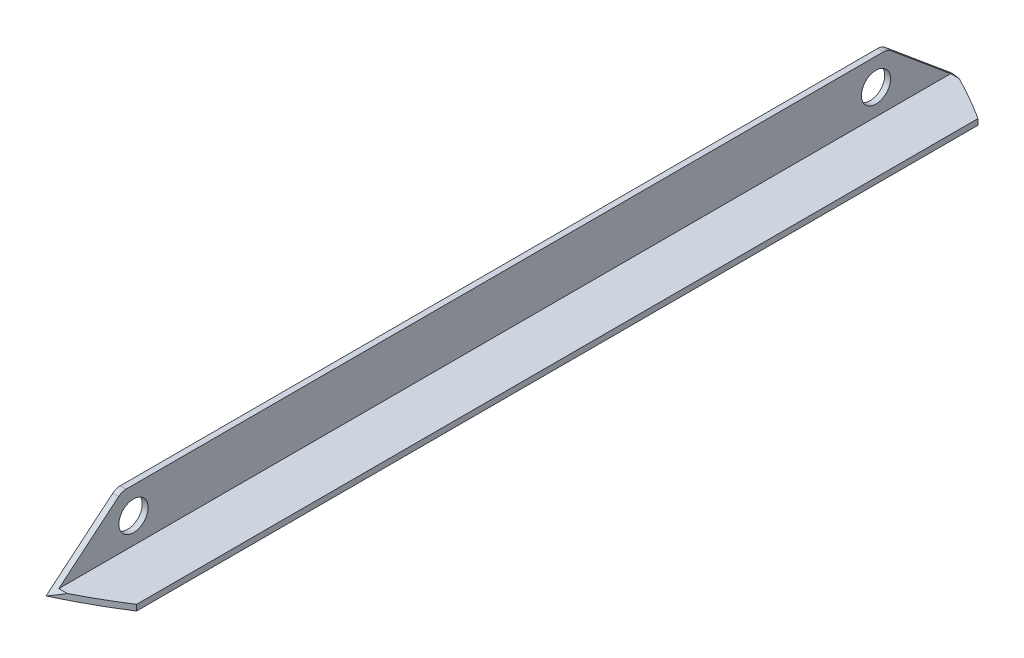
ISO-10303-21;
HEADER;
FILE_DESCRIPTION(('STEP AP214'),'2;1');
FILE_NAME('part.step','',(''),(''),'','','');
FILE_SCHEMA(('AUTOMOTIVE_DESIGN { 1 0 10303 214 1 1 1 1 }'));
ENDSEC;
DATA;
#1=APPLICATION_CONTEXT('core data for automotive mechanical design processes');
#2=APPLICATION_PROTOCOL_DEFINITION('international standard','automotive_design',2000,#1);
#3=PRODUCT_CONTEXT('',#1,'mechanical');
#4=PRODUCT('Part','Part','',(#3));
#5=PRODUCT_RELATED_PRODUCT_CATEGORY('part','',(#4));
#6=PRODUCT_DEFINITION_FORMATION('','',#4);
#7=PRODUCT_DEFINITION_CONTEXT('part definition',#1,'design');
#8=PRODUCT_DEFINITION('design','',#6,#7);
#9=PRODUCT_DEFINITION_SHAPE('','',#8);
#10=(LENGTH_UNIT() NAMED_UNIT(*) SI_UNIT(.MILLI.,.METRE.));
#11=(NAMED_UNIT(*) PLANE_ANGLE_UNIT() SI_UNIT($,.RADIAN.));
#12=(NAMED_UNIT(*) SI_UNIT($,.STERADIAN.) SOLID_ANGLE_UNIT());
#13=UNCERTAINTY_MEASURE_WITH_UNIT(LENGTH_MEASURE(1.E-05),#10,'distance_accuracy_value','');
#14=(GEOMETRIC_REPRESENTATION_CONTEXT(3) GLOBAL_UNCERTAINTY_ASSIGNED_CONTEXT((#13)) GLOBAL_UNIT_ASSIGNED_CONTEXT((#10,
#11,#12)) REPRESENTATION_CONTEXT('',''));
#15=CARTESIAN_POINT('',(0.,0.,0.));
#16=DIRECTION('',(0.,0.,1.));
#17=DIRECTION('',(1.,0.,0.));
#18=AXIS2_PLACEMENT_3D('',#15,#16,#17);
#19=CARTESIAN_POINT('',(-9.02439024390239,-5.73170731707306,500.));
#20=DIRECTION('',(0.,1.,0.));
#21=DIRECTION('',(-0.999999999999999,0.,0.));
#22=AXIS2_PLACEMENT_3D('',#19,#20,#21);
#23=PLANE('',#22);
#24=DIRECTION('',(0.,0.,-0.999999999999999));
#25=VECTOR('',#24,1.);
#26=CARTESIAN_POINT('',(-9.02439024390239,-5.73170731707306,500.));
#27=LINE('',#26,#25);
#28=CARTESIAN_POINT('',(-9.02439024390239,-5.73170731707306,382.162337173508));
#29=VERTEX_POINT('',#28);
#30=CARTESIAN_POINT('',(-9.02439024390239,-5.73170731707306,-382.162337173507));
#31=VERTEX_POINT('',#30);
#32=EDGE_CURVE('E130',#29,#31,#27,.T.);
#33=ORIENTED_EDGE('',*,*,#32,.F.);
#34=DIRECTION('',(0.999999999999999,0.,0.));
#35=VECTOR('',#34,1.);
#36=CARTESIAN_POINT('',(-9.02439024390239,-5.73170731707306,382.162337173508));
#37=LINE('',#36,#35);
#38=CARTESIAN_POINT('',(-1.70953517318789,-5.73170731707306,382.162337173508));
#39=VERTEX_POINT('',#38);
#40=EDGE_CURVE('E114',#29,#39,#37,.T.);
#41=ORIENTED_EDGE('',*,*,#40,.T.);
#42=CARTESIAN_POINT('',(-195.524390243902,-5.73170731707306,0.));
#43=DIRECTION('',(0.,1.,0.));
#44=DIRECTION('',(-0.999999999999999,0.,0.));
#45=AXIS2_PLACEMENT_3D('',#42,#43,#44);
#46=CIRCLE('',#45,428.5);
#47=CARTESIAN_POINT('',(35.9756097560976,-5.73170731707306,360.582861489561));
#48=VERTEX_POINT('',#47);
#49=EDGE_CURVE('E126',#48,#39,#46,.F.);
#50=ORIENTED_EDGE('',*,*,#49,.F.);
#51=DIRECTION('',(0.,0.,-0.999999999999999));
#52=VECTOR('',#51,1.);
#53=CARTESIAN_POINT('',(35.9756097560976,-5.73170731707306,500.));
#54=LINE('',#53,#52);
#55=CARTESIAN_POINT('',(35.9756097560976,-5.73170731707306,-360.582861489561));
#56=VERTEX_POINT('',#55);
#57=EDGE_CURVE('E146',#48,#56,#54,.T.);
#58=ORIENTED_EDGE('',*,*,#57,.T.);
#59=CARTESIAN_POINT('',(-195.524390243902,-5.73170731707306,0.));
#60=DIRECTION('',(0.,1.,0.));
#61=DIRECTION('',(-0.999999999999999,0.,0.));
#62=AXIS2_PLACEMENT_3D('',#59,#60,#61);
#63=CIRCLE('',#62,428.5);
#64=CARTESIAN_POINT('',(-1.70953517318789,-5.73170731707306,-382.162337173507));
#65=VERTEX_POINT('',#64);
#66=EDGE_CURVE('E138',#65,#56,#63,.F.);
#67=ORIENTED_EDGE('',*,*,#66,.F.);
#68=DIRECTION('',(0.999999999999999,0.,0.));
#69=VECTOR('',#68,1.);
#70=CARTESIAN_POINT('',(-9.02439024390256,-5.73170731707306,-382.162337173507));
#71=LINE('',#70,#69);
#72=EDGE_CURVE('E194',#31,#65,#71,.T.);
#73=ORIENTED_EDGE('',*,*,#72,.F.);
#74=EDGE_LOOP('',(#33,#41,#50,#58,#67,#73));
#75=FACE_BOUND('',#74,.T.);
#76=ADVANCED_FACE('F36',(#75),#23,.T.);
#77=CARTESIAN_POINT('',(-14.0243902439024,39.2682926829269,500.));
#78=DIRECTION('',(0.,1.,0.));
#79=DIRECTION('',(0.,0.,0.999999999999999));
#80=AXIS2_PLACEMENT_3D('',#77,#78,#79);
#81=PLANE('',#80);
#82=DIRECTION('',(0.,0.,-0.999999999999999));
#83=VECTOR('',#82,1.);
#84=CARTESIAN_POINT('',(-14.0243902439024,39.2682926829269,500.));
#85=LINE('',#84,#83);
#86=CARTESIAN_POINT('',(-14.0243902439024,39.2682926829269,324.541837821695));
#87=VERTEX_POINT('',#86);
#88=CARTESIAN_POINT('',(-14.0243902439024,39.2682926829269,-324.541837821694));
#89=VERTEX_POINT('',#88);
#90=EDGE_CURVE('E153',#87,#89,#85,.T.);
#91=ORIENTED_EDGE('',*,*,#90,.F.);
#92=DIRECTION('',(0.999999999999999,0.,0.));
#93=VECTOR('',#92,1.);
#94=CARTESIAN_POINT('',(-14.0243902439024,39.2682926829269,324.541837821695));
#95=LINE('',#94,#93);
#96=CARTESIAN_POINT('',(-9.02439024390245,39.2682926829269,324.541837821695));
#97=VERTEX_POINT('',#96);
#98=EDGE_CURVE('E167',#87,#97,#95,.T.);
#99=ORIENTED_EDGE('',*,*,#98,.T.);
#100=DIRECTION('',(0.,0.,-0.999999999999999));
#101=VECTOR('',#100,1.);
#102=CARTESIAN_POINT('',(-9.02439024390245,39.2682926829269,500.));
#103=LINE('',#102,#101);
#104=CARTESIAN_POINT('',(-9.02439024390243,39.2682926829269,-324.541837821694));
#105=VERTEX_POINT('',#104);
#106=EDGE_CURVE('E150',#97,#105,#103,.T.);
#107=ORIENTED_EDGE('',*,*,#106,.T.);
#108=DIRECTION('',(0.999999999999999,0.,0.));
#109=VECTOR('',#108,1.);
#110=CARTESIAN_POINT('',(-14.0243902439024,39.2682926829269,-324.541837821694));
#111=LINE('',#110,#109);
#112=EDGE_CURVE('E120',#105,#89,#111,.F.);
#113=ORIENTED_EDGE('',*,*,#112,.T.);
#114=EDGE_LOOP('',(#91,#99,#107,#113));
#115=FACE_BOUND('',#114,.T.);
#116=ADVANCED_FACE('F219',(#115),#81,.T.);
#117=CARTESIAN_POINT('',(-9.02439024390245,39.2682926829269,500.));
#118=DIRECTION('',(0.999999999999999,0.,0.));
#119=DIRECTION('',(0.,1.,0.));
#120=AXIS2_PLACEMENT_3D('',#117,#118,#119);
#121=PLANE('',#120);
#122=CARTESIAN_POINT('',(-9.02439024390243,16.2682926829267,-318.162337173507));
#123=DIRECTION('',(0.999999999999999,0.,0.));
#124=DIRECTION('',(0.,1.,0.));
#125=AXIS2_PLACEMENT_3D('',#122,#123,#124);
#126=CIRCLE('',#125,12.5);
#127=CARTESIAN_POINT('',(-9.02439024390243,28.7682926829267,-318.162337173507));
#128=VERTEX_POINT('',#127);
#129=EDGE_CURVE('E178',#128,#128,#126,.T.);
#130=ORIENTED_EDGE('',*,*,#129,.F.);
#131=EDGE_LOOP('',(#130));
#132=FACE_BOUND('',#131,.T.);
#133=CARTESIAN_POINT('',(-9.02439024390245,16.2682926829267,318.162337173508));
#134=DIRECTION('',(0.999999999999999,0.,0.));
#135=DIRECTION('',(0.,-1.,0.));
#136=AXIS2_PLACEMENT_3D('',#133,#134,#135);
#137=CIRCLE('',#136,12.5);
#138=CARTESIAN_POINT('',(-9.02439024390245,28.7682926829267,318.162337173508));
#139=VERTEX_POINT('',#138);
#140=EDGE_CURVE('E183',#139,#139,#137,.T.);
#141=ORIENTED_EDGE('',*,*,#140,.F.);
#142=EDGE_LOOP('',(#141));
#143=FACE_BOUND('',#142,.T.);
#144=ORIENTED_EDGE('',*,*,#106,.F.);
#145=CARTESIAN_POINT('',(-9.02439024390245,29.2682926829269,324.541837821695));
#146=DIRECTION('',(0.999999999999999,0.,0.));
#147=DIRECTION('',(0.,1.,0.));
#148=AXIS2_PLACEMENT_3D('',#145,#146,#147);
#149=CIRCLE('',#148,10.);
#150=CARTESIAN_POINT('',(-9.02439024390245,36.9505054789006,330.943681818339));
#151=VERTEX_POINT('',#150);
#152=EDGE_CURVE('E172',#97,#151,#149,.T.);
#153=ORIENTED_EDGE('',*,*,#152,.T.);
#154=DIRECTION('',(0.,-0.64018439966448,0.768221279597375));
#155=VECTOR('',#154,1.);
#156=CARTESIAN_POINT('',(-9.02439024390238,-45.2420332973151,429.574728349798));
#157=LINE('',#156,#155);
#158=EDGE_CURVE('E131',#151,#29,#157,.T.);
#159=ORIENTED_EDGE('',*,*,#158,.T.);
#160=ORIENTED_EDGE('',*,*,#32,.T.);
#161=DIRECTION('',(0.,-0.64018439966448,-0.768221279597375));
#162=VECTOR('',#161,1.);
#163=CARTESIAN_POINT('',(-9.02439024390245,446.56124539121,160.589206076431));
#164=LINE('',#163,#162);
#165=CARTESIAN_POINT('',(-9.02439024390243,36.9505054789006,-330.943681818339));
#166=VERTEX_POINT('',#165);
#167=EDGE_CURVE('E140',#166,#31,#164,.T.);
#168=ORIENTED_EDGE('',*,*,#167,.F.);
#169=CARTESIAN_POINT('',(-9.02439024390243,29.2682926829269,-324.541837821694));
#170=DIRECTION('',(0.999999999999999,0.,0.));
#171=DIRECTION('',(0.,1.,0.));
#172=AXIS2_PLACEMENT_3D('',#169,#170,#171);
#173=CIRCLE('',#172,10.);
#174=EDGE_CURVE('E170',#166,#105,#173,.T.);
#175=ORIENTED_EDGE('',*,*,#174,.T.);
#176=EDGE_LOOP('',(#144,#153,#159,#160,#168,#175));
#177=FACE_BOUND('',#176,.T.);
#178=ADVANCED_FACE('F201',(#132,#143,#177),#121,.T.);
#179=CARTESIAN_POINT('',(-14.0243902439024,-10.7317073170732,500.));
#180=DIRECTION('',(-0.999999999999999,0.,0.));
#181=DIRECTION('',(0.,0.,0.999999999999999));
#182=AXIS2_PLACEMENT_3D('',#179,#180,#181);
#183=PLANE('',#182);
#184=CARTESIAN_POINT('',(-14.0243902439024,16.2682926829267,-318.162337173507));
#185=DIRECTION('',(-0.999999999999999,0.,0.));
#186=DIRECTION('',(0.,0.,0.999999999999999));
#187=AXIS2_PLACEMENT_3D('',#184,#185,#186);
#188=CIRCLE('',#187,12.5);
#189=CARTESIAN_POINT('',(-14.0243902439024,28.7682926829267,-318.162337173507));
#190=VERTEX_POINT('',#189);
#191=EDGE_CURVE('E40',#190,#190,#188,.T.);
#192=ORIENTED_EDGE('',*,*,#191,.F.);
#193=EDGE_LOOP('',(#192));
#194=FACE_BOUND('',#193,.T.);
#195=CARTESIAN_POINT('',(-14.0243902439024,16.2682926829267,318.162337173508));
#196=DIRECTION('',(-0.999999999999999,0.,0.));
#197=DIRECTION('',(0.,0.,0.999999999999999));
#198=AXIS2_PLACEMENT_3D('',#195,#196,#197);
#199=CIRCLE('',#198,12.5);
#200=CARTESIAN_POINT('',(-14.0243902439025,28.7682926829267,318.162337173508));
#201=VERTEX_POINT('',#200);
#202=EDGE_CURVE('E176',#201,#201,#199,.T.);
#203=ORIENTED_EDGE('',*,*,#202,.F.);
#204=EDGE_LOOP('',(#203));
#205=FACE_BOUND('',#204,.T.);
#206=DIRECTION('',(0.,0.64018439966448,-0.768221279597375));
#207=VECTOR('',#206,1.);
#208=CARTESIAN_POINT('',(-14.0243902439024,-65.7338365760036,454.164892284224));
#209=LINE('',#208,#207);
#210=CARTESIAN_POINT('',(-14.0243902439024,-10.7317073170732,388.162337173508));
#211=VERTEX_POINT('',#210);
#212=CARTESIAN_POINT('',(-14.0243902439024,36.9505054789006,330.943681818339));
#213=VERTEX_POINT('',#212);
#214=EDGE_CURVE('E116',#211,#213,#209,.T.);
#215=ORIENTED_EDGE('',*,*,#214,.T.);
#216=CARTESIAN_POINT('',(-14.0243902439024,29.2682926829269,324.541837821695));
#217=DIRECTION('',(-0.999999999999999,0.,0.));
#218=DIRECTION('',(0.,0.,0.999999999999999));
#219=AXIS2_PLACEMENT_3D('',#216,#217,#218);
#220=CIRCLE('',#219,10.);
#221=EDGE_CURVE('E45',#213,#87,#220,.T.);
#222=ORIENTED_EDGE('',*,*,#221,.T.);
#223=ORIENTED_EDGE('',*,*,#90,.T.);
#224=CARTESIAN_POINT('',(-14.0243902439024,29.2682926829269,-324.541837821694));
#225=DIRECTION('',(-0.999999999999999,0.,0.));
#226=DIRECTION('',(0.,0.,0.999999999999999));
#227=AXIS2_PLACEMENT_3D('',#224,#225,#226);
#228=CIRCLE('',#227,10.);
#229=CARTESIAN_POINT('',(-14.0243902439024,36.9505054789006,-330.943681818339));
#230=VERTEX_POINT('',#229);
#231=EDGE_CURVE('E53',#89,#230,#228,.T.);
#232=ORIENTED_EDGE('',*,*,#231,.T.);
#233=DIRECTION('',(0.,0.64018439966448,0.768221279597375));
#234=VECTOR('',#233,1.);
#235=CARTESIAN_POINT('',(-14.0243902439024,426.069442112521,135.999042142005));
#236=LINE('',#235,#234);
#237=CARTESIAN_POINT('',(-14.0243902439023,-10.7317073170732,-388.162337173507));
#238=VERTEX_POINT('',#237);
#239=EDGE_CURVE('E192',#238,#230,#236,.T.);
#240=ORIENTED_EDGE('',*,*,#239,.F.);
#241=DIRECTION('',(0.,0.,-0.999999999999999));
#242=VECTOR('',#241,1.);
#243=CARTESIAN_POINT('',(-14.0243902439024,-10.7317073170732,500.));
#244=LINE('',#243,#242);
#245=EDGE_CURVE('E155',#211,#238,#244,.T.);
#246=ORIENTED_EDGE('',*,*,#245,.F.);
#247=EDGE_LOOP('',(#215,#222,#223,#232,#240,#246));
#248=FACE_BOUND('',#247,.T.);
#249=ADVANCED_FACE('F213',(#194,#205,#248),#183,.T.);
#250=CARTESIAN_POINT('',(-195.524390243902,-30.7317073170734,0.));
#251=DIRECTION('',(0.,1.,0.));
#252=DIRECTION('',(-0.999999999999999,0.,0.));
#253=AXIS2_PLACEMENT_3D('',#250,#251,#252);
#254=CYLINDRICAL_SURFACE('',#253,428.5);
#255=CARTESIAN_POINT('',(-195.524390243902,312.736906994183,0.));
#256=DIRECTION('',(0.,0.768221279597376,0.640184399664479));
#257=DIRECTION('',(0.,0.64018439966448,-0.768221279597375));
#258=AXIS2_PLACEMENT_3D('',#255,#256,#257);
#259=ELLIPSE('',#258,557.781997687667,428.5);
#260=EDGE_CURVE('E111',#211,#39,#259,.T.);
#261=ORIENTED_EDGE('',*,*,#260,.F.);
#262=CARTESIAN_POINT('',(-195.524390243902,-10.7317073170732,0.));
#263=DIRECTION('',(0.,-1.,0.));
#264=DIRECTION('',(0.999999999999999,0.,0.));
#265=AXIS2_PLACEMENT_3D('',#262,#263,#264);
#266=CIRCLE('',#265,428.5);
#267=CARTESIAN_POINT('',(35.9756097560976,-10.7317073170732,360.582861489561));
#268=VERTEX_POINT('',#267);
#269=EDGE_CURVE('E148',#211,#268,#266,.F.);
#270=ORIENTED_EDGE('',*,*,#269,.T.);
#271=DIRECTION('',(0.,1.,0.));
#272=VECTOR('',#271,1.);
#273=CARTESIAN_POINT('',(35.9756097560976,-30.7317073170734,360.582861489561));
#274=LINE('',#273,#272);
#275=EDGE_CURVE('E135',#268,#48,#274,.T.);
#276=ORIENTED_EDGE('',*,*,#275,.T.);
#277=ORIENTED_EDGE('',*,*,#49,.T.);
#278=EDGE_LOOP('',(#261,#270,#276,#277));
#279=FACE_BOUND('',#278,.T.);
#280=ADVANCED_FACE('F133',(#279),#254,.T.);
#281=CARTESIAN_POINT('',(35.9756097560976,-10.7317073170732,500.));
#282=DIRECTION('',(0.,-1.,0.));
#283=DIRECTION('',(0.999999999999999,0.,0.));
#284=AXIS2_PLACEMENT_3D('',#281,#282,#283);
#285=PLANE('',#284);
#286=CARTESIAN_POINT('',(-195.524390243902,-10.7317073170732,0.));
#287=DIRECTION('',(0.,-1.,0.));
#288=DIRECTION('',(0.999999999999999,0.,0.));
#289=AXIS2_PLACEMENT_3D('',#286,#287,#288);
#290=CIRCLE('',#289,428.5);
#291=CARTESIAN_POINT('',(35.9756097560976,-10.7317073170732,-360.582861489561));
#292=VERTEX_POINT('',#291);
#293=EDGE_CURVE('E161',#292,#238,#290,.F.);
#294=ORIENTED_EDGE('',*,*,#293,.F.);
#295=DIRECTION('',(0.,0.,-0.999999999999999));
#296=VECTOR('',#295,1.);
#297=CARTESIAN_POINT('',(35.9756097560976,-10.7317073170732,500.));
#298=LINE('',#297,#296);
#299=EDGE_CURVE('E145',#268,#292,#298,.T.);
#300=ORIENTED_EDGE('',*,*,#299,.F.);
#301=ORIENTED_EDGE('',*,*,#269,.F.);
#302=ORIENTED_EDGE('',*,*,#245,.T.);
#303=EDGE_LOOP('',(#294,#300,#301,#302));
#304=FACE_BOUND('',#303,.T.);
#305=ADVANCED_FACE('F211',(#304),#285,.T.);
#306=CARTESIAN_POINT('',(35.9756097560976,-5.73170731707306,500.));
#307=DIRECTION('',(0.999999999999999,0.,0.));
#308=DIRECTION('',(0.,0.,-0.999999999999999));
#309=AXIS2_PLACEMENT_3D('',#306,#307,#308);
#310=PLANE('',#309);
#311=DIRECTION('',(0.,1.,0.));
#312=VECTOR('',#311,1.);
#313=CARTESIAN_POINT('',(35.9756097560976,-30.7317073170734,-360.582861489561));
#314=LINE('',#313,#312);
#315=EDGE_CURVE('E136',#56,#292,#314,.F.);
#316=ORIENTED_EDGE('',*,*,#315,.F.);
#317=ORIENTED_EDGE('',*,*,#57,.F.);
#318=ORIENTED_EDGE('',*,*,#275,.F.);
#319=ORIENTED_EDGE('',*,*,#299,.T.);
#320=EDGE_LOOP('',(#316,#317,#318,#319));
#321=FACE_BOUND('',#320,.T.);
#322=ADVANCED_FACE('F208',(#321),#310,.T.);
#323=CARTESIAN_POINT('',(-195.524390243902,-30.7317073170734,0.));
#324=DIRECTION('',(0.,1.,0.));
#325=DIRECTION('',(-0.999999999999999,0.,0.));
#326=AXIS2_PLACEMENT_3D('',#323,#324,#325);
#327=CYLINDRICAL_SURFACE('',#326,428.5);
#328=ORIENTED_EDGE('',*,*,#293,.T.);
#329=CARTESIAN_POINT('',(-195.524390243902,312.736906994183,0.));
#330=DIRECTION('',(0.,-0.768221279597376,0.640184399664479));
#331=DIRECTION('',(0.,0.64018439966448,0.768221279597375));
#332=AXIS2_PLACEMENT_3D('',#329,#330,#331);
#333=ELLIPSE('',#332,557.781997687667,428.5);
#334=EDGE_CURVE('E121',#238,#65,#333,.T.);
#335=ORIENTED_EDGE('',*,*,#334,.T.);
#336=ORIENTED_EDGE('',*,*,#66,.T.);
#337=ORIENTED_EDGE('',*,*,#315,.T.);
#338=EDGE_LOOP('',(#328,#335,#336,#337));
#339=FACE_BOUND('',#338,.T.);
#340=ADVANCED_FACE('F205',(#339),#327,.T.);
#341=CARTESIAN_POINT('',(-44.0243902439024,-10.7317073170732,-388.162337173507));
#342=DIRECTION('',(0.,-0.768221279597376,0.640184399664479));
#343=DIRECTION('',(0.,-0.64018439966448,-0.768221279597375));
#344=AXIS2_PLACEMENT_3D('',#341,#342,#343);
#345=PLANE('',#344);
#346=ORIENTED_EDGE('',*,*,#239,.T.);
#347=DIRECTION('',(0.999999999999999,0.,0.));
#348=VECTOR('',#347,1.);
#349=CARTESIAN_POINT('',(-9.02439024390243,36.9505054789006,-330.943681818339));
#350=LINE('',#349,#348);
#351=EDGE_CURVE('E11',#230,#166,#350,.T.);
#352=ORIENTED_EDGE('',*,*,#351,.T.);
#353=ORIENTED_EDGE('',*,*,#167,.T.);
#354=ORIENTED_EDGE('',*,*,#72,.T.);
#355=ORIENTED_EDGE('',*,*,#334,.F.);
#356=EDGE_LOOP('',(#346,#352,#353,#354,#355));
#357=FACE_BOUND('',#356,.T.);
#358=ADVANCED_FACE('F197',(#357),#345,.F.);
#359=CARTESIAN_POINT('',(-44.0243902439024,-10.7317073170732,388.162337173508));
#360=DIRECTION('',(0.,0.768221279597376,0.640184399664479));
#361=DIRECTION('',(0.,-0.64018439966448,0.768221279597375));
#362=AXIS2_PLACEMENT_3D('',#359,#360,#361);
#363=PLANE('',#362);
#364=ORIENTED_EDGE('',*,*,#158,.F.);
#365=DIRECTION('',(0.999999999999999,0.,0.));
#366=VECTOR('',#365,1.);
#367=CARTESIAN_POINT('',(-44.0243902439024,36.9505054789006,330.943681818339));
#368=LINE('',#367,#366);
#369=EDGE_CURVE('E61',#151,#213,#368,.F.);
#370=ORIENTED_EDGE('',*,*,#369,.T.);
#371=ORIENTED_EDGE('',*,*,#214,.F.);
#372=ORIENTED_EDGE('',*,*,#260,.T.);
#373=ORIENTED_EDGE('',*,*,#40,.F.);
#374=EDGE_LOOP('',(#364,#370,#371,#372,#373));
#375=FACE_BOUND('',#374,.T.);
#376=ADVANCED_FACE('F113',(#375),#363,.T.);
#377=CARTESIAN_POINT('',(-14.0243902439024,29.2682926829269,324.541837821695));
#378=DIRECTION('',(0.999999999999999,0.,0.));
#379=DIRECTION('',(0.,0.,-0.999999999999999));
#380=AXIS2_PLACEMENT_3D('',#377,#378,#379);
#381=CYLINDRICAL_SURFACE('',#380,10.);
#382=ORIENTED_EDGE('',*,*,#221,.F.);
#383=ORIENTED_EDGE('',*,*,#369,.F.);
#384=ORIENTED_EDGE('',*,*,#152,.F.);
#385=ORIENTED_EDGE('',*,*,#98,.F.);
#386=EDGE_LOOP('',(#382,#383,#384,#385));
#387=FACE_BOUND('',#386,.T.);
#388=ADVANCED_FACE('F222',(#387),#381,.T.);
#389=CARTESIAN_POINT('',(-44.0243902439024,29.2682926829269,-324.541837821694));
#390=DIRECTION('',(-0.999999999999999,0.,0.));
#391=DIRECTION('',(0.,0.,0.999999999999999));
#392=AXIS2_PLACEMENT_3D('',#389,#390,#391);
#393=CYLINDRICAL_SURFACE('',#392,10.);
#394=ORIENTED_EDGE('',*,*,#231,.F.);
#395=ORIENTED_EDGE('',*,*,#112,.F.);
#396=ORIENTED_EDGE('',*,*,#174,.F.);
#397=ORIENTED_EDGE('',*,*,#351,.F.);
#398=EDGE_LOOP('',(#394,#395,#396,#397));
#399=FACE_BOUND('',#398,.T.);
#400=ADVANCED_FACE('F38',(#399),#393,.T.);
#401=CARTESIAN_POINT('',(-79.0243902439023,16.2682926829267,318.162337173508));
#402=DIRECTION('',(0.999999999999999,0.,0.));
#403=DIRECTION('',(0.,1.,0.));
#404=AXIS2_PLACEMENT_3D('',#401,#402,#403);
#405=CYLINDRICAL_SURFACE('',#404,12.5);
#406=CARTESIAN_POINT('',(-14.0243902439025,28.7682926829267,318.162337173508));
#407=CARTESIAN_POINT('',(-13.9723069105691,28.7682926829267,318.162337173508));
#408=CARTESIAN_POINT('',(-13.9202235772358,28.7682926829267,318.162337173508));
#409=CARTESIAN_POINT('',(-13.8160569105691,28.7682926829267,318.162337173508));
#410=CARTESIAN_POINT('',(-13.7639735772358,28.7682926829267,318.162337173508));
#411=CARTESIAN_POINT('',(-13.6598069105691,28.7682926829267,318.162337173508));
#412=CARTESIAN_POINT('',(-13.6077235772358,28.7682926829267,318.162337173508));
#413=CARTESIAN_POINT('',(-13.5035569105691,28.7682926829267,318.162337173508));
#414=CARTESIAN_POINT('',(-13.4514735772358,28.7682926829267,318.162337173508));
#415=CARTESIAN_POINT('',(-13.3473069105691,28.7682926829267,318.162337173508));
#416=CARTESIAN_POINT('',(-13.2952235772358,28.7682926829267,318.162337173508));
#417=CARTESIAN_POINT('',(-13.1910569105691,28.7682926829267,318.162337173508));
#418=CARTESIAN_POINT('',(-13.1389735772358,28.7682926829267,318.162337173508));
#419=CARTESIAN_POINT('',(-13.0348069105691,28.7682926829267,318.162337173508));
#420=CARTESIAN_POINT('',(-12.9827235772358,28.7682926829267,318.162337173508));
#421=CARTESIAN_POINT('',(-12.8785569105691,28.7682926829267,318.162337173508));
#422=CARTESIAN_POINT('',(-12.8264735772358,28.7682926829267,318.162337173508));
#423=CARTESIAN_POINT('',(-12.7223069105691,28.7682926829267,318.162337173508));
#424=CARTESIAN_POINT('',(-12.6702235772358,28.7682926829267,318.162337173508));
#425=CARTESIAN_POINT('',(-12.5660569105691,28.7682926829267,318.162337173508));
#426=CARTESIAN_POINT('',(-12.5139735772358,28.7682926829267,318.162337173508));
#427=CARTESIAN_POINT('',(-12.4098069105691,28.7682926829267,318.162337173508));
#428=CARTESIAN_POINT('',(-12.3577235772358,28.7682926829267,318.162337173508));
#429=CARTESIAN_POINT('',(-12.2535569105691,28.7682926829267,318.162337173508));
#430=CARTESIAN_POINT('',(-12.2014735772358,28.7682926829267,318.162337173508));
#431=CARTESIAN_POINT('',(-12.0973069105691,28.7682926829267,318.162337173508));
#432=CARTESIAN_POINT('',(-12.0452235772358,28.7682926829267,318.162337173508));
#433=CARTESIAN_POINT('',(-11.9410569105691,28.7682926829267,318.162337173508));
#434=CARTESIAN_POINT('',(-11.8889735772358,28.7682926829267,318.162337173508));
#435=CARTESIAN_POINT('',(-11.7848069105691,28.7682926829267,318.162337173508));
#436=CARTESIAN_POINT('',(-11.7327235772358,28.7682926829267,318.162337173508));
#437=CARTESIAN_POINT('',(-11.6285569105691,28.7682926829267,318.162337173508));
#438=CARTESIAN_POINT('',(-11.5764735772358,28.7682926829267,318.162337173508));
#439=CARTESIAN_POINT('',(-11.4723069105691,28.7682926829267,318.162337173508));
#440=CARTESIAN_POINT('',(-11.4202235772358,28.7682926829267,318.162337173508));
#441=CARTESIAN_POINT('',(-11.3160569105691,28.7682926829267,318.162337173508));
#442=CARTESIAN_POINT('',(-11.2639735772358,28.7682926829267,318.162337173508));
#443=CARTESIAN_POINT('',(-11.1598069105691,28.7682926829267,318.162337173508));
#444=CARTESIAN_POINT('',(-11.1077235772358,28.7682926829267,318.162337173508));
#445=CARTESIAN_POINT('',(-11.0035569105691,28.7682926829267,318.162337173508));
#446=CARTESIAN_POINT('',(-10.9514735772358,28.7682926829267,318.162337173508));
#447=CARTESIAN_POINT('',(-10.8473069105691,28.7682926829267,318.162337173508));
#448=CARTESIAN_POINT('',(-10.7952235772358,28.7682926829267,318.162337173508));
#449=CARTESIAN_POINT('',(-10.6910569105691,28.7682926829267,318.162337173508));
#450=CARTESIAN_POINT('',(-10.6389735772358,28.7682926829267,318.162337173508));
#451=CARTESIAN_POINT('',(-10.5348069105691,28.7682926829267,318.162337173508));
#452=CARTESIAN_POINT('',(-10.4827235772358,28.7682926829267,318.162337173508));
#453=CARTESIAN_POINT('',(-10.3785569105691,28.7682926829267,318.162337173508));
#454=CARTESIAN_POINT('',(-10.3264735772358,28.7682926829267,318.162337173508));
#455=CARTESIAN_POINT('',(-10.2223069105691,28.7682926829267,318.162337173508));
#456=CARTESIAN_POINT('',(-10.1702235772358,28.7682926829267,318.162337173508));
#457=CARTESIAN_POINT('',(-10.0660569105691,28.7682926829267,318.162337173508));
#458=CARTESIAN_POINT('',(-10.0139735772358,28.7682926829267,318.162337173508));
#459=CARTESIAN_POINT('',(-9.90980691056912,28.7682926829267,318.162337173508));
#460=CARTESIAN_POINT('',(-9.85772357723578,28.7682926829267,318.162337173508));
#461=CARTESIAN_POINT('',(-9.75355691056911,28.7682926829267,318.162337173508));
#462=CARTESIAN_POINT('',(-9.70147357723578,28.7682926829267,318.162337173508));
#463=CARTESIAN_POINT('',(-9.59730691056911,28.7682926829267,318.162337173508));
#464=CARTESIAN_POINT('',(-9.54522357723578,28.7682926829267,318.162337173508));
#465=CARTESIAN_POINT('',(-9.44105691056911,28.7682926829267,318.162337173508));
#466=CARTESIAN_POINT('',(-9.38897357723578,28.7682926829267,318.162337173508));
#467=CARTESIAN_POINT('',(-9.28480691056911,28.7682926829267,318.162337173508));
#468=CARTESIAN_POINT('',(-9.23272357723578,28.7682926829267,318.162337173508));
#469=CARTESIAN_POINT('',(-9.12855691056911,28.7682926829267,318.162337173508));
#470=CARTESIAN_POINT('',(-9.07647357723578,28.7682926829267,318.162337173508));
#471=CARTESIAN_POINT('',(-9.02439024390245,28.7682926829267,318.162337173508));
#472=B_SPLINE_CURVE_WITH_KNOTS('',3,(#406,#407,#408,#409,#410,#411,#412,#413,#414,#415,#416,
#417,#418,#419,#420,#421,#422,#423,#424,#425,#426,#427,#428,#429,#430,#431,#432,#433,#434,#435,
#436,#437,#438,#439,#440,#441,#442,#443,#444,#445,#446,#447,#448,#449,#450,#451,#452,#453,#454,
#455,#456,#457,#458,#459,#460,#461,#462,#463,#464,#465,#466,#467,#468,#469,#470,#471),
.UNSPECIFIED.,.F.,.F.,(4,2,2,2,2,2,2,2,2,2,2,2,2,2,2,2,2,2,2,2,2,2,2,2,2,2,2,2,2,2,2,2,4),(0.,
0.156249999999997,0.312499999999993,0.468750000000004,0.625000000000001,0.781249999999997,
0.937500000000008,1.09375,1.25,1.40625,1.56249999999999,1.71875,1.875,2.03125,2.18750000000001,
2.34375000000001,2.5,2.65625,2.8125,2.96875000000001,3.125,3.28125,3.43750000000001,
3.59375000000001,3.75,3.90625,4.0625,4.21875000000001,4.375,4.53125,4.68750000000001,
4.84375000000001,5.),.UNSPECIFIED.);
#473=EDGE_CURVE('BSEAM228',#201,#139,#472,.T.);
#474=ORIENTED_EDGE('',*,*,#202,.T.);
#475=ORIENTED_EDGE('',*,*,#140,.T.);
#476=ORIENTED_EDGE('',*,*,#473,.T.);
#477=ORIENTED_EDGE('',*,*,#473,.F.);
#478=EDGE_LOOP('',(#474,#476,#475,#477));
#479=FACE_BOUND('',#478,.T.);
#480=ADVANCED_FACE('F228',(#479),#405,.F.);
#481=CARTESIAN_POINT('',(-79.0243902439023,16.2682926829267,-318.162337173507));
#482=DIRECTION('',(0.999999999999999,0.,0.));
#483=DIRECTION('',(0.,1.,0.));
#484=AXIS2_PLACEMENT_3D('',#481,#482,#483);
#485=CYLINDRICAL_SURFACE('',#484,12.5);
#486=CARTESIAN_POINT('',(-14.0243902439024,28.7682926829267,-318.162337173507));
#487=CARTESIAN_POINT('',(-13.9723069105691,28.7682926829267,-318.162337173507));
#488=CARTESIAN_POINT('',(-13.9202235772358,28.7682926829267,-318.162337173507));
#489=CARTESIAN_POINT('',(-13.8160569105691,28.7682926829267,-318.162337173507));
#490=CARTESIAN_POINT('',(-13.7639735772358,28.7682926829267,-318.162337173507));
#491=CARTESIAN_POINT('',(-13.6598069105691,28.7682926829267,-318.162337173507));
#492=CARTESIAN_POINT('',(-13.6077235772358,28.7682926829267,-318.162337173507));
#493=CARTESIAN_POINT('',(-13.5035569105691,28.7682926829267,-318.162337173507));
#494=CARTESIAN_POINT('',(-13.4514735772358,28.7682926829267,-318.162337173507));
#495=CARTESIAN_POINT('',(-13.3473069105691,28.7682926829267,-318.162337173507));
#496=CARTESIAN_POINT('',(-13.2952235772358,28.7682926829267,-318.162337173507));
#497=CARTESIAN_POINT('',(-13.1910569105691,28.7682926829267,-318.162337173507));
#498=CARTESIAN_POINT('',(-13.1389735772358,28.7682926829267,-318.162337173507));
#499=CARTESIAN_POINT('',(-13.0348069105691,28.7682926829267,-318.162337173507));
#500=CARTESIAN_POINT('',(-12.9827235772358,28.7682926829267,-318.162337173507));
#501=CARTESIAN_POINT('',(-12.8785569105691,28.7682926829267,-318.162337173507));
#502=CARTESIAN_POINT('',(-12.8264735772358,28.7682926829267,-318.162337173507));
#503=CARTESIAN_POINT('',(-12.7223069105691,28.7682926829267,-318.162337173507));
#504=CARTESIAN_POINT('',(-12.6702235772358,28.7682926829267,-318.162337173507));
#505=CARTESIAN_POINT('',(-12.5660569105691,28.7682926829267,-318.162337173507));
#506=CARTESIAN_POINT('',(-12.5139735772358,28.7682926829267,-318.162337173507));
#507=CARTESIAN_POINT('',(-12.4098069105691,28.7682926829267,-318.162337173507));
#508=CARTESIAN_POINT('',(-12.3577235772358,28.7682926829267,-318.162337173507));
#509=CARTESIAN_POINT('',(-12.2535569105691,28.7682926829267,-318.162337173507));
#510=CARTESIAN_POINT('',(-12.2014735772358,28.7682926829267,-318.162337173507));
#511=CARTESIAN_POINT('',(-12.0973069105691,28.7682926829267,-318.162337173507));
#512=CARTESIAN_POINT('',(-12.0452235772358,28.7682926829267,-318.162337173507));
#513=CARTESIAN_POINT('',(-11.9410569105691,28.7682926829267,-318.162337173507));
#514=CARTESIAN_POINT('',(-11.8889735772358,28.7682926829267,-318.162337173507));
#515=CARTESIAN_POINT('',(-11.7848069105691,28.7682926829267,-318.162337173507));
#516=CARTESIAN_POINT('',(-11.7327235772358,28.7682926829267,-318.162337173507));
#517=CARTESIAN_POINT('',(-11.6285569105691,28.7682926829267,-318.162337173507));
#518=CARTESIAN_POINT('',(-11.5764735772358,28.7682926829267,-318.162337173507));
#519=CARTESIAN_POINT('',(-11.4723069105691,28.7682926829267,-318.162337173507));
#520=CARTESIAN_POINT('',(-11.4202235772358,28.7682926829267,-318.162337173507));
#521=CARTESIAN_POINT('',(-11.3160569105691,28.7682926829267,-318.162337173507));
#522=CARTESIAN_POINT('',(-11.2639735772358,28.7682926829267,-318.162337173507));
#523=CARTESIAN_POINT('',(-11.1598069105691,28.7682926829267,-318.162337173507));
#524=CARTESIAN_POINT('',(-11.1077235772358,28.7682926829267,-318.162337173507));
#525=CARTESIAN_POINT('',(-11.0035569105691,28.7682926829267,-318.162337173507));
#526=CARTESIAN_POINT('',(-10.9514735772358,28.7682926829267,-318.162337173507));
#527=CARTESIAN_POINT('',(-10.8473069105691,28.7682926829267,-318.162337173507));
#528=CARTESIAN_POINT('',(-10.7952235772358,28.7682926829267,-318.162337173507));
#529=CARTESIAN_POINT('',(-10.6910569105691,28.7682926829267,-318.162337173507));
#530=CARTESIAN_POINT('',(-10.6389735772358,28.7682926829267,-318.162337173507));
#531=CARTESIAN_POINT('',(-10.5348069105691,28.7682926829267,-318.162337173507));
#532=CARTESIAN_POINT('',(-10.4827235772358,28.7682926829267,-318.162337173507));
#533=CARTESIAN_POINT('',(-10.3785569105691,28.7682926829267,-318.162337173507));
#534=CARTESIAN_POINT('',(-10.3264735772358,28.7682926829267,-318.162337173507));
#535=CARTESIAN_POINT('',(-10.2223069105691,28.7682926829267,-318.162337173507));
#536=CARTESIAN_POINT('',(-10.1702235772358,28.7682926829267,-318.162337173507));
#537=CARTESIAN_POINT('',(-10.0660569105691,28.7682926829267,-318.162337173507));
#538=CARTESIAN_POINT('',(-10.0139735772358,28.7682926829267,-318.162337173507));
#539=CARTESIAN_POINT('',(-9.9098069105691,28.7682926829267,-318.162337173507));
#540=CARTESIAN_POINT('',(-9.85772357723577,28.7682926829267,-318.162337173507));
#541=CARTESIAN_POINT('',(-9.7535569105691,28.7682926829267,-318.162337173507));
#542=CARTESIAN_POINT('',(-9.70147357723577,28.7682926829267,-318.162337173507));
#543=CARTESIAN_POINT('',(-9.5973069105691,28.7682926829267,-318.162337173507));
#544=CARTESIAN_POINT('',(-9.54522357723577,28.7682926829267,-318.162337173507));
#545=CARTESIAN_POINT('',(-9.4410569105691,28.7682926829267,-318.162337173507));
#546=CARTESIAN_POINT('',(-9.38897357723576,28.7682926829267,-318.162337173507));
#547=CARTESIAN_POINT('',(-9.28480691056909,28.7682926829267,-318.162337173507));
#548=CARTESIAN_POINT('',(-9.23272357723576,28.7682926829267,-318.162337173507));
#549=CARTESIAN_POINT('',(-9.1285569105691,28.7682926829267,-318.162337173507));
#550=CARTESIAN_POINT('',(-9.07647357723577,28.7682926829267,-318.162337173507));
#551=CARTESIAN_POINT('',(-9.02439024390243,28.7682926829267,-318.162337173507));
#552=B_SPLINE_CURVE_WITH_KNOTS('',3,(#486,#487,#488,#489,#490,#491,#492,#493,#494,#495,#496,
#497,#498,#499,#500,#501,#502,#503,#504,#505,#506,#507,#508,#509,#510,#511,#512,#513,#514,#515,
#516,#517,#518,#519,#520,#521,#522,#523,#524,#525,#526,#527,#528,#529,#530,#531,#532,#533,#534,
#535,#536,#537,#538,#539,#540,#541,#542,#543,#544,#545,#546,#547,#548,#549,#550,#551),
.UNSPECIFIED.,.F.,.F.,(4,2,2,2,2,2,2,2,2,2,2,2,2,2,2,2,2,2,2,2,2,2,2,2,2,2,2,2,2,2,2,2,4),(0.,
0.156249999999997,0.312499999999993,0.468750000000004,0.625000000000001,0.781249999999997,
0.937500000000008,1.09375,1.25,1.40625,1.56249999999999,1.71875,1.875,2.03125,2.18750000000001,
2.34375000000001,2.5,2.65625,2.8125,2.96875000000001,3.125,3.28125,3.43750000000001,
3.59375000000001,3.75,3.90625,4.0625,4.21875000000001,4.375,4.53125,4.68750000000001,
4.84375000000001,5.),.UNSPECIFIED.);
#553=EDGE_CURVE('BSEAM258',#190,#128,#552,.T.);
#554=ORIENTED_EDGE('',*,*,#191,.T.);
#555=ORIENTED_EDGE('',*,*,#129,.T.);
#556=ORIENTED_EDGE('',*,*,#553,.T.);
#557=ORIENTED_EDGE('',*,*,#553,.F.);
#558=EDGE_LOOP('',(#554,#556,#555,#557));
#559=FACE_BOUND('',#558,.T.);
#560=ADVANCED_FACE('F258',(#559),#485,.F.);
#561=CLOSED_SHELL('',(#76,#116,#178,#249,#280,#305,#322,#340,#358,#376,#388,#400,#480,#560));
#562=MANIFOLD_SOLID_BREP('B2',#561);
#563=ADVANCED_BREP_SHAPE_REPRESENTATION('',(#18,#562),#14);
#564=SHAPE_DEFINITION_REPRESENTATION(#9,#563);
ENDSEC;
END-ISO-10303-21;
